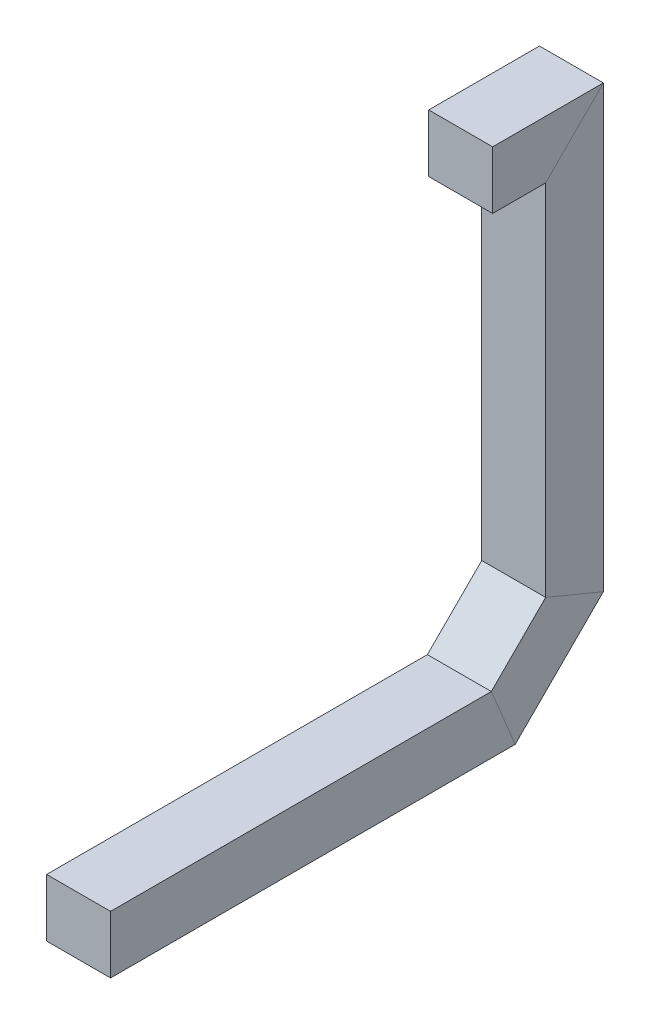
ISO-10303-21;
HEADER;
FILE_DESCRIPTION(('STEP AP214'),'2;1');
FILE_NAME('part.step','',(''),(''),'','','');
FILE_SCHEMA(('AUTOMOTIVE_DESIGN { 1 0 10303 214 1 1 1 1 }'));
ENDSEC;
DATA;
#1=APPLICATION_CONTEXT('core data for automotive mechanical design processes');
#2=APPLICATION_PROTOCOL_DEFINITION('international standard','automotive_design',2000,#1);
#3=PRODUCT_CONTEXT('',#1,'mechanical');
#4=PRODUCT('Part','Part','',(#3));
#5=PRODUCT_RELATED_PRODUCT_CATEGORY('part','',(#4));
#6=PRODUCT_DEFINITION_FORMATION('','',#4);
#7=PRODUCT_DEFINITION_CONTEXT('part definition',#1,'design');
#8=PRODUCT_DEFINITION('design','',#6,#7);
#9=PRODUCT_DEFINITION_SHAPE('','',#8);
#10=(LENGTH_UNIT() NAMED_UNIT(*) SI_UNIT(.MILLI.,.METRE.));
#11=(NAMED_UNIT(*) PLANE_ANGLE_UNIT() SI_UNIT($,.RADIAN.));
#12=(NAMED_UNIT(*) SI_UNIT($,.STERADIAN.) SOLID_ANGLE_UNIT());
#13=UNCERTAINTY_MEASURE_WITH_UNIT(LENGTH_MEASURE(1.E-05),#10,'distance_accuracy_value','');
#14=(GEOMETRIC_REPRESENTATION_CONTEXT(3) GLOBAL_UNCERTAINTY_ASSIGNED_CONTEXT((#13)) GLOBAL_UNIT_ASSIGNED_CONTEXT((#10,
#11,#12)) REPRESENTATION_CONTEXT('',''));
#15=CARTESIAN_POINT('',(0.,0.,0.));
#16=DIRECTION('',(0.,0.,1.));
#17=DIRECTION('',(1.,0.,0.));
#18=AXIS2_PLACEMENT_3D('',#15,#16,#17);
#19=CARTESIAN_POINT('',(0.,2860.04,2387.6));
#20=DIRECTION('',(0.,0.,-1.));
#21=DIRECTION('',(1.,0.,0.));
#22=AXIS2_PLACEMENT_3D('',#19,#20,#21);
#23=PLANE('',#22);
#24=DIRECTION('',(0.,-1.,0.));
#25=VECTOR('',#24,1.);
#26=CARTESIAN_POINT('',(194.406682087314,-178.080899930985,2387.6));
#27=LINE('',#26,#25);
#28=CARTESIAN_POINT('',(194.406682087314,173.000899930981,2387.6));
#29=VERTEX_POINT('',#28);
#30=CARTESIAN_POINT('',(194.406682087314,-178.080899930985,2387.6));
#31=VERTEX_POINT('',#30);
#32=EDGE_CURVE('E107',#29,#31,#27,.T.);
#33=ORIENTED_EDGE('',*,*,#32,.F.);
#34=DIRECTION('',(1.,0.,0.));
#35=VECTOR('',#34,1.);
#36=CARTESIAN_POINT('',(-194.406682087314,173.000899930981,2387.6));
#37=LINE('',#36,#35);
#38=CARTESIAN_POINT('',(-194.406682087314,173.000899930981,2387.6));
#39=VERTEX_POINT('',#38);
#40=EDGE_CURVE('E109',#39,#29,#37,.T.);
#41=ORIENTED_EDGE('',*,*,#40,.F.);
#42=DIRECTION('',(0.,1.,0.));
#43=VECTOR('',#42,1.);
#44=CARTESIAN_POINT('',(-194.406682087314,-178.080899930985,2387.6));
#45=LINE('',#44,#43);
#46=CARTESIAN_POINT('',(-194.406682087314,-178.080899930985,2387.6));
#47=VERTEX_POINT('',#46);
#48=EDGE_CURVE('E92',#47,#39,#45,.T.);
#49=ORIENTED_EDGE('',*,*,#48,.F.);
#50=DIRECTION('',(-1.,0.,0.));
#51=VECTOR('',#50,1.);
#52=CARTESIAN_POINT('',(-194.406682087314,-178.080899930985,2387.6));
#53=LINE('',#52,#51);
#54=EDGE_CURVE('E99',#31,#47,#53,.T.);
#55=ORIENTED_EDGE('',*,*,#54,.F.);
#56=EDGE_LOOP('',(#33,#41,#49,#55));
#57=FACE_BOUND('',#56,.T.);
#58=ADVANCED_FACE('F33',(#57),#23,.F.);
#59=CARTESIAN_POINT('',(0.,0.,63.5));
#60=DIRECTION('',(0.,0.,1.));
#61=DIRECTION('',(1.,0.,0.));
#62=AXIS2_PLACEMENT_3D('',#59,#60,#61);
#63=PLANE('',#62);
#64=DIRECTION('',(0.,1.,0.));
#65=VECTOR('',#64,1.);
#66=CARTESIAN_POINT('',(194.406682087314,3038.12089993098,63.5));
#67=LINE('',#66,#65);
#68=CARTESIAN_POINT('',(194.406682087314,2687.03910006902,63.5));
#69=VERTEX_POINT('',#68);
#70=CARTESIAN_POINT('',(194.406682087314,3038.12089993098,63.5));
#71=VERTEX_POINT('',#70);
#72=EDGE_CURVE('E178',#69,#71,#67,.T.);
#73=ORIENTED_EDGE('',*,*,#72,.T.);
#74=DIRECTION('',(-1.,0.,0.));
#75=VECTOR('',#74,1.);
#76=CARTESIAN_POINT('',(-194.406682087314,3038.12089993098,63.5));
#77=LINE('',#76,#75);
#78=CARTESIAN_POINT('',(-194.406682087314,3038.12089993098,63.5));
#79=VERTEX_POINT('',#78);
#80=EDGE_CURVE('E174',#71,#79,#77,.T.);
#81=ORIENTED_EDGE('',*,*,#80,.T.);
#82=DIRECTION('',(0.,-1.,0.));
#83=VECTOR('',#82,1.);
#84=CARTESIAN_POINT('',(-194.406682087314,3038.12089993098,63.5));
#85=LINE('',#84,#83);
#86=CARTESIAN_POINT('',(-194.406682087314,2687.03910006902,63.5));
#87=VERTEX_POINT('',#86);
#88=EDGE_CURVE('E168',#79,#87,#85,.T.);
#89=ORIENTED_EDGE('',*,*,#88,.T.);
#90=DIRECTION('',(1.,0.,0.));
#91=VECTOR('',#90,1.);
#92=CARTESIAN_POINT('',(-194.406682087314,2687.03910006902,63.5));
#93=LINE('',#92,#91);
#94=EDGE_CURVE('E184',#87,#69,#93,.T.);
#95=ORIENTED_EDGE('',*,*,#94,.T.);
#96=EDGE_LOOP('',(#73,#81,#89,#95));
#97=FACE_BOUND('',#96,.T.);
#98=ADVANCED_FACE('F234',(#97),#63,.T.);
#99=CARTESIAN_POINT('',(-194.406682087314,-178.080899930985,-81.2398763461221));
#100=DIRECTION('',(1.,0.,0.));
#101=DIRECTION('',(0.,0.,-1.));
#102=AXIS2_PLACEMENT_3D('',#99,#100,#101);
#103=PLANE('',#102);
#104=DIRECTION('',(0.,-0.923879532511287,-0.38268343236509));
#105=VECTOR('',#104,1.);
#106=CARTESIAN_POINT('',(-194.406682087314,92.6210777975562,38.3649065853613));
#107=LINE('',#106,#105);
#108=CARTESIAN_POINT('',(-194.406682087314,173.000899930981,71.659319054163));
#109=VERTEX_POINT('',#108);
#110=CARTESIAN_POINT('',(-194.406682087314,-178.080899930985,-73.7635239510199));
#111=VERTEX_POINT('',#110);
#112=EDGE_CURVE('E113',#109,#111,#107,.T.);
#113=ORIENTED_EDGE('',*,*,#112,.T.);
#114=DIRECTION('',(0.,0.,1.));
#115=VECTOR('',#114,1.);
#116=CARTESIAN_POINT('',(-194.406682087314,-178.080899930985,-81.2398763461221));
#117=LINE('',#116,#115);
#118=EDGE_CURVE('E36',#111,#47,#117,.T.);
#119=ORIENTED_EDGE('',*,*,#118,.T.);
#120=ORIENTED_EDGE('',*,*,#48,.T.);
#121=DIRECTION('',(0.,0.,1.));
#122=VECTOR('',#121,1.);
#123=CARTESIAN_POINT('',(-194.406682087314,173.000899930981,-81.2398763461221));
#124=LINE('',#123,#122);
#125=EDGE_CURVE('E116',#109,#39,#124,.T.);
#126=ORIENTED_EDGE('',*,*,#125,.F.);
#127=EDGE_LOOP('',(#113,#119,#120,#126));
#128=FACE_BOUND('',#127,.T.);
#129=ADVANCED_FACE('F112',(#128),#103,.F.);
#130=CARTESIAN_POINT('',(-194.406682087314,173.000899930981,-81.2398763461221));
#131=DIRECTION('',(0.,-1.,0.));
#132=DIRECTION('',(0.,0.,-1.));
#133=AXIS2_PLACEMENT_3D('',#130,#131,#132);
#134=PLANE('',#133);
#135=DIRECTION('',(-1.,0.,0.));
#136=VECTOR('',#135,1.);
#137=CARTESIAN_POINT('',(-194.406682087314,173.000899930981,71.6593190541631));
#138=LINE('',#137,#136);
#139=CARTESIAN_POINT('',(194.406682087314,173.000899930981,71.6593190541629));
#140=VERTEX_POINT('',#139);
#141=EDGE_CURVE('E142',#140,#109,#138,.T.);
#142=ORIENTED_EDGE('',*,*,#141,.T.);
#143=ORIENTED_EDGE('',*,*,#125,.T.);
#144=ORIENTED_EDGE('',*,*,#40,.T.);
#145=DIRECTION('',(0.,0.,1.));
#146=VECTOR('',#145,1.);
#147=CARTESIAN_POINT('',(194.406682087314,173.000899930981,-81.2398763461221));
#148=LINE('',#147,#146);
#149=EDGE_CURVE('E120',#140,#29,#148,.T.);
#150=ORIENTED_EDGE('',*,*,#149,.F.);
#151=EDGE_LOOP('',(#142,#143,#144,#150));
#152=FACE_BOUND('',#151,.T.);
#153=ADVANCED_FACE('F240',(#152),#134,.F.);
#154=CARTESIAN_POINT('',(194.406682087314,-178.080899930985,-81.2398763461221));
#155=DIRECTION('',(-1.,0.,0.));
#156=DIRECTION('',(0.,0.,1.));
#157=AXIS2_PLACEMENT_3D('',#154,#155,#156);
#158=PLANE('',#157);
#159=DIRECTION('',(0.,0.923879532511287,0.38268343236509));
#160=VECTOR('',#159,1.);
#161=CARTESIAN_POINT('',(194.406682087314,92.6210777975562,38.3649065853613));
#162=LINE('',#161,#160);
#163=CARTESIAN_POINT('',(194.406682087314,-178.080899930985,-73.7635239510199));
#164=VERTEX_POINT('',#163);
#165=EDGE_CURVE('E139',#164,#140,#162,.T.);
#166=ORIENTED_EDGE('',*,*,#165,.T.);
#167=ORIENTED_EDGE('',*,*,#149,.T.);
#168=ORIENTED_EDGE('',*,*,#32,.T.);
#169=DIRECTION('',(0.,0.,1.));
#170=VECTOR('',#169,1.);
#171=CARTESIAN_POINT('',(194.406682087314,-178.080899930985,-81.2398763461221));
#172=LINE('',#171,#170);
#173=EDGE_CURVE('E104',#164,#31,#172,.T.);
#174=ORIENTED_EDGE('',*,*,#173,.F.);
#175=EDGE_LOOP('',(#166,#167,#168,#174));
#176=FACE_BOUND('',#175,.T.);
#177=ADVANCED_FACE('F282',(#176),#158,.F.);
#178=CARTESIAN_POINT('',(-194.406682087314,-178.080899930985,-81.2398763461221));
#179=DIRECTION('',(0.,1.,0.));
#180=DIRECTION('',(0.,0.,1.));
#181=AXIS2_PLACEMENT_3D('',#178,#179,#180);
#182=PLANE('',#181);
#183=DIRECTION('',(1.,0.,0.));
#184=VECTOR('',#183,1.);
#185=CARTESIAN_POINT('',(-194.406682087314,-178.080899930985,-73.7635239510197));
#186=LINE('',#185,#184);
#187=EDGE_CURVE('E130',#111,#164,#186,.T.);
#188=ORIENTED_EDGE('',*,*,#187,.T.);
#189=ORIENTED_EDGE('',*,*,#173,.T.);
#190=ORIENTED_EDGE('',*,*,#54,.T.);
#191=ORIENTED_EDGE('',*,*,#118,.F.);
#192=EDGE_LOOP('',(#188,#189,#190,#191));
#193=FACE_BOUND('',#192,.T.);
#194=ADVANCED_FACE('F101',(#193),#182,.F.);
#195=CARTESIAN_POINT('',(-194.406682087314,363.323055526097,-615.167479408101));
#196=DIRECTION('',(0.,0.707106781186547,0.707106781186547));
#197=DIRECTION('',(0.,-0.707106781186548,0.707106781186548));
#198=AXIS2_PLACEMENT_3D('',#195,#196,#197);
#199=PLANE('',#198);
#200=DIRECTION('',(0.,-0.707106781186547,0.707106781186547));
#201=VECTOR('',#200,1.);
#202=CARTESIAN_POINT('',(-194.406682087314,363.323055526097,-615.167479408101));
#203=LINE('',#202,#201);
#204=CARTESIAN_POINT('',(-194.406682087314,358.03647604898,-609.880899930984));
#205=VERTEX_POINT('',#204);
#206=EDGE_CURVE('E131',#205,#111,#203,.T.);
#207=ORIENTED_EDGE('',*,*,#206,.F.);
#208=DIRECTION('',(1.,0.,0.));
#209=VECTOR('',#208,1.);
#210=CARTESIAN_POINT('',(-194.406682087314,358.03647604898,-609.880899930984));
#211=LINE('',#210,#209);
#212=CARTESIAN_POINT('',(194.406682087314,358.03647604898,-609.880899930984));
#213=VERTEX_POINT('',#212);
#214=EDGE_CURVE('E148',#205,#213,#211,.T.);
#215=ORIENTED_EDGE('',*,*,#214,.T.);
#216=DIRECTION('',(0.,-0.707106781186547,0.707106781186547));
#217=VECTOR('',#216,1.);
#218=CARTESIAN_POINT('',(194.406682087314,363.323055526097,-615.167479408101));
#219=LINE('',#218,#217);
#220=EDGE_CURVE('E115',#213,#164,#219,.T.);
#221=ORIENTED_EDGE('',*,*,#220,.T.);
#222=ORIENTED_EDGE('',*,*,#187,.F.);
#223=EDGE_LOOP('',(#207,#215,#221,#222));
#224=FACE_BOUND('',#223,.T.);
#225=ADVANCED_FACE('F275',(#224),#199,.F.);
#226=CARTESIAN_POINT('',(194.406682087314,363.323055526097,-615.167479408101));
#227=DIRECTION('',(-1.,0.,0.));
#228=DIRECTION('',(0.,0.,1.));
#229=AXIS2_PLACEMENT_3D('',#226,#227,#228);
#230=PLANE('',#229);
#231=ORIENTED_EDGE('',*,*,#220,.F.);
#232=DIRECTION('',(0.,0.38268343236509,0.923879532511287));
#233=VECTOR('',#232,1.);
#234=CARTESIAN_POINT('',(194.406682087314,753.148331910719,344.003501144828));
#235=LINE('',#234,#233);
#236=CARTESIAN_POINT('',(194.406682087314,503.459319054163,-258.799100069018));
#237=VERTEX_POINT('',#236);
#238=EDGE_CURVE('E162',#213,#237,#235,.T.);
#239=ORIENTED_EDGE('',*,*,#238,.T.);
#240=DIRECTION('',(0.,-0.707106781186547,0.707106781186547));
#241=VECTOR('',#240,1.);
#242=CARTESIAN_POINT('',(194.406682087314,611.575376959671,-366.915157974527));
#243=LINE('',#242,#241);
#244=EDGE_CURVE('E118',#237,#140,#243,.T.);
#245=ORIENTED_EDGE('',*,*,#244,.T.);
#246=ORIENTED_EDGE('',*,*,#165,.F.);
#247=EDGE_LOOP('',(#231,#239,#245,#246));
#248=FACE_BOUND('',#247,.T.);
#249=ADVANCED_FACE('F271',(#248),#230,.F.);
#250=CARTESIAN_POINT('',(-194.406682087314,611.575376959671,-366.915157974527));
#251=DIRECTION('',(0.,-0.707106781186547,-0.707106781186547));
#252=DIRECTION('',(0.,0.707106781186548,-0.707106781186548));
#253=AXIS2_PLACEMENT_3D('',#250,#251,#252);
#254=PLANE('',#253);
#255=ORIENTED_EDGE('',*,*,#244,.F.);
#256=DIRECTION('',(-1.,0.,0.));
#257=VECTOR('',#256,1.);
#258=CARTESIAN_POINT('',(-194.406682087314,503.459319054163,-258.799100069018));
#259=LINE('',#258,#257);
#260=CARTESIAN_POINT('',(-194.406682087314,503.459319054163,-258.799100069018));
#261=VERTEX_POINT('',#260);
#262=EDGE_CURVE('E165',#237,#261,#259,.T.);
#263=ORIENTED_EDGE('',*,*,#262,.T.);
#264=DIRECTION('',(0.,-0.707106781186547,0.707106781186547));
#265=VECTOR('',#264,1.);
#266=CARTESIAN_POINT('',(-194.406682087314,611.575376959671,-366.915157974527));
#267=LINE('',#266,#265);
#268=EDGE_CURVE('E133',#261,#109,#267,.T.);
#269=ORIENTED_EDGE('',*,*,#268,.T.);
#270=ORIENTED_EDGE('',*,*,#141,.F.);
#271=EDGE_LOOP('',(#255,#263,#269,#270));
#272=FACE_BOUND('',#271,.T.);
#273=ADVANCED_FACE('F267',(#272),#254,.F.);
#274=CARTESIAN_POINT('',(-194.406682087314,363.323055526097,-615.167479408101));
#275=DIRECTION('',(1.,0.,0.));
#276=DIRECTION('',(0.,0.,-1.));
#277=AXIS2_PLACEMENT_3D('',#274,#275,#276);
#278=PLANE('',#277);
#279=ORIENTED_EDGE('',*,*,#268,.F.);
#280=DIRECTION('',(0.,-0.38268343236509,-0.923879532511287));
#281=VECTOR('',#280,1.);
#282=CARTESIAN_POINT('',(-194.406682087314,753.148331910719,344.003501144828));
#283=LINE('',#282,#281);
#284=EDGE_CURVE('E145',#261,#205,#283,.T.);
#285=ORIENTED_EDGE('',*,*,#284,.T.);
#286=ORIENTED_EDGE('',*,*,#206,.T.);
#287=ORIENTED_EDGE('',*,*,#112,.F.);
#288=EDGE_LOOP('',(#279,#285,#286,#287));
#289=FACE_BOUND('',#288,.T.);
#290=ADVANCED_FACE('F264',(#289),#278,.F.);
#291=CARTESIAN_POINT('',(-194.406682087314,3056.02898992408,-609.880899930984));
#292=DIRECTION('',(0.,0.,1.));
#293=DIRECTION('',(1.,0.,0.));
#294=AXIS2_PLACEMENT_3D('',#291,#292,#293);
#295=PLANE('',#294);
#296=DIRECTION('',(0.,-1.,0.));
#297=VECTOR('',#296,1.);
#298=CARTESIAN_POINT('',(-194.406682087314,3056.02898992408,-609.880899930984));
#299=LINE('',#298,#297);
#300=CARTESIAN_POINT('',(-194.406682087314,3038.12089993098,-609.880899930983));
#301=VERTEX_POINT('',#300);
#302=EDGE_CURVE('E149',#301,#205,#299,.T.);
#303=ORIENTED_EDGE('',*,*,#302,.F.);
#304=DIRECTION('',(1.,0.,0.));
#305=VECTOR('',#304,1.);
#306=CARTESIAN_POINT('',(-194.406682087314,3038.12089993098,-609.880899930983));
#307=LINE('',#306,#305);
#308=CARTESIAN_POINT('',(194.406682087314,3038.12089993098,-609.880899930983));
#309=VERTEX_POINT('',#308);
#310=EDGE_CURVE('E172',#301,#309,#307,.T.);
#311=ORIENTED_EDGE('',*,*,#310,.T.);
#312=DIRECTION('',(0.,-1.,0.));
#313=VECTOR('',#312,1.);
#314=CARTESIAN_POINT('',(194.406682087314,3056.02898992408,-609.880899930984));
#315=LINE('',#314,#313);
#316=EDGE_CURVE('E144',#309,#213,#315,.T.);
#317=ORIENTED_EDGE('',*,*,#316,.T.);
#318=ORIENTED_EDGE('',*,*,#214,.F.);
#319=EDGE_LOOP('',(#303,#311,#317,#318));
#320=FACE_BOUND('',#319,.T.);
#321=ADVANCED_FACE('F224',(#320),#295,.F.);
#322=CARTESIAN_POINT('',(194.406682087314,3056.02898992408,-609.880899930984));
#323=DIRECTION('',(-1.,0.,0.));
#324=DIRECTION('',(0.,0.,1.));
#325=AXIS2_PLACEMENT_3D('',#322,#323,#324);
#326=PLANE('',#325);
#327=ORIENTED_EDGE('',*,*,#316,.F.);
#328=DIRECTION('',(0.,-0.707106781186548,0.707106781186548));
#329=VECTOR('',#328,1.);
#330=CARTESIAN_POINT('',(194.406682087314,2701.43044996549,-273.190449965491));
#331=LINE('',#330,#329);
#332=CARTESIAN_POINT('',(194.406682087314,2687.03910006902,-258.799100069018));
#333=VERTEX_POINT('',#332);
#334=EDGE_CURVE('E42',#309,#333,#331,.T.);
#335=ORIENTED_EDGE('',*,*,#334,.T.);
#336=DIRECTION('',(0.,-1.,0.));
#337=VECTOR('',#336,1.);
#338=CARTESIAN_POINT('',(194.406682087314,3056.02898992408,-258.799100069018));
#339=LINE('',#338,#337);
#340=EDGE_CURVE('E155',#333,#237,#339,.T.);
#341=ORIENTED_EDGE('',*,*,#340,.T.);
#342=ORIENTED_EDGE('',*,*,#238,.F.);
#343=EDGE_LOOP('',(#327,#335,#341,#342));
#344=FACE_BOUND('',#343,.T.);
#345=ADVANCED_FACE('F200',(#344),#326,.F.);
#346=CARTESIAN_POINT('',(-194.406682087314,3056.02898992408,-258.799100069018));
#347=DIRECTION('',(0.,0.,-1.));
#348=DIRECTION('',(-1.,0.,0.));
#349=AXIS2_PLACEMENT_3D('',#346,#347,#348);
#350=PLANE('',#349);
#351=ORIENTED_EDGE('',*,*,#340,.F.);
#352=DIRECTION('',(-1.,0.,0.));
#353=VECTOR('',#352,1.);
#354=CARTESIAN_POINT('',(-194.406682087314,2687.03910006902,-258.799100069017));
#355=LINE('',#354,#353);
#356=CARTESIAN_POINT('',(-194.406682087314,2687.03910006902,-258.799100069018));
#357=VERTEX_POINT('',#356);
#358=EDGE_CURVE('E11',#333,#357,#355,.T.);
#359=ORIENTED_EDGE('',*,*,#358,.T.);
#360=DIRECTION('',(0.,-1.,0.));
#361=VECTOR('',#360,1.);
#362=CARTESIAN_POINT('',(-194.406682087314,3056.02898992408,-258.799100069018));
#363=LINE('',#362,#361);
#364=EDGE_CURVE('E152',#357,#261,#363,.T.);
#365=ORIENTED_EDGE('',*,*,#364,.T.);
#366=ORIENTED_EDGE('',*,*,#262,.F.);
#367=EDGE_LOOP('',(#351,#359,#365,#366));
#368=FACE_BOUND('',#367,.T.);
#369=ADVANCED_FACE('F256',(#368),#350,.F.);
#370=CARTESIAN_POINT('',(-194.406682087314,3056.02898992408,-609.880899930984));
#371=DIRECTION('',(1.,0.,0.));
#372=DIRECTION('',(0.,0.,-1.));
#373=AXIS2_PLACEMENT_3D('',#370,#371,#372);
#374=PLANE('',#373);
#375=ORIENTED_EDGE('',*,*,#364,.F.);
#376=DIRECTION('',(0.,0.707106781186548,-0.707106781186548));
#377=VECTOR('',#376,1.);
#378=CARTESIAN_POINT('',(-194.406682087314,2701.43044996549,-273.190449965491));
#379=LINE('',#378,#377);
#380=EDGE_CURVE('E169',#357,#301,#379,.T.);
#381=ORIENTED_EDGE('',*,*,#380,.T.);
#382=ORIENTED_EDGE('',*,*,#302,.T.);
#383=ORIENTED_EDGE('',*,*,#284,.F.);
#384=EDGE_LOOP('',(#375,#381,#382,#383));
#385=FACE_BOUND('',#384,.T.);
#386=ADVANCED_FACE('F228',(#385),#374,.F.);
#387=CARTESIAN_POINT('',(-194.406682087314,3038.12089993098,63.5));
#388=DIRECTION('',(0.,-1.,0.));
#389=DIRECTION('',(0.,0.,-1.));
#390=AXIS2_PLACEMENT_3D('',#387,#388,#389);
#391=PLANE('',#390);
#392=DIRECTION('',(0.,0.,-1.));
#393=VECTOR('',#392,1.);
#394=CARTESIAN_POINT('',(-194.406682087314,3038.12089993098,63.5));
#395=LINE('',#394,#393);
#396=EDGE_CURVE('E177',#79,#301,#395,.T.);
#397=ORIENTED_EDGE('',*,*,#396,.F.);
#398=ORIENTED_EDGE('',*,*,#80,.F.);
#399=DIRECTION('',(0.,0.,-1.));
#400=VECTOR('',#399,1.);
#401=CARTESIAN_POINT('',(194.406682087314,3038.12089993098,63.5));
#402=LINE('',#401,#400);
#403=EDGE_CURVE('E173',#71,#309,#402,.T.);
#404=ORIENTED_EDGE('',*,*,#403,.T.);
#405=ORIENTED_EDGE('',*,*,#310,.F.);
#406=EDGE_LOOP('',(#397,#398,#404,#405));
#407=FACE_BOUND('',#406,.T.);
#408=ADVANCED_FACE('F222',(#407),#391,.F.);
#409=CARTESIAN_POINT('',(194.406682087314,3038.12089993098,63.5));
#410=DIRECTION('',(-1.,0.,0.));
#411=DIRECTION('',(0.,0.,1.));
#412=AXIS2_PLACEMENT_3D('',#409,#410,#411);
#413=PLANE('',#412);
#414=ORIENTED_EDGE('',*,*,#403,.F.);
#415=ORIENTED_EDGE('',*,*,#72,.F.);
#416=DIRECTION('',(0.,0.,-1.));
#417=VECTOR('',#416,1.);
#418=CARTESIAN_POINT('',(194.406682087314,2687.03910006902,63.5));
#419=LINE('',#418,#417);
#420=EDGE_CURVE('E181',#69,#333,#419,.T.);
#421=ORIENTED_EDGE('',*,*,#420,.T.);
#422=ORIENTED_EDGE('',*,*,#334,.F.);
#423=EDGE_LOOP('',(#414,#415,#421,#422));
#424=FACE_BOUND('',#423,.T.);
#425=ADVANCED_FACE('F204',(#424),#413,.F.);
#426=CARTESIAN_POINT('',(-194.406682087314,2687.03910006902,63.5));
#427=DIRECTION('',(0.,1.,0.));
#428=DIRECTION('',(0.,0.,1.));
#429=AXIS2_PLACEMENT_3D('',#426,#427,#428);
#430=PLANE('',#429);
#431=ORIENTED_EDGE('',*,*,#420,.F.);
#432=ORIENTED_EDGE('',*,*,#94,.F.);
#433=DIRECTION('',(0.,0.,-1.));
#434=VECTOR('',#433,1.);
#435=CARTESIAN_POINT('',(-194.406682087314,2687.03910006902,63.5));
#436=LINE('',#435,#434);
#437=EDGE_CURVE('E187',#87,#357,#436,.T.);
#438=ORIENTED_EDGE('',*,*,#437,.T.);
#439=ORIENTED_EDGE('',*,*,#358,.F.);
#440=EDGE_LOOP('',(#431,#432,#438,#439));
#441=FACE_BOUND('',#440,.T.);
#442=ADVANCED_FACE('F207',(#441),#430,.F.);
#443=CARTESIAN_POINT('',(-194.406682087314,3038.12089993098,63.5));
#444=DIRECTION('',(1.,0.,0.));
#445=DIRECTION('',(0.,0.,-1.));
#446=AXIS2_PLACEMENT_3D('',#443,#444,#445);
#447=PLANE('',#446);
#448=ORIENTED_EDGE('',*,*,#437,.F.);
#449=ORIENTED_EDGE('',*,*,#88,.F.);
#450=ORIENTED_EDGE('',*,*,#396,.T.);
#451=ORIENTED_EDGE('',*,*,#380,.F.);
#452=EDGE_LOOP('',(#448,#449,#450,#451));
#453=FACE_BOUND('',#452,.T.);
#454=ADVANCED_FACE('F232',(#453),#447,.F.);
#455=CLOSED_SHELL('',(#58,#98,#129,#153,#177,#194,#225,#249,#273,#290,#321,#345,#369,#386,#408,
#425,#442,#454));
#456=MANIFOLD_SOLID_BREP('B2',#455);
#457=ADVANCED_BREP_SHAPE_REPRESENTATION('',(#18,#456),#14);
#458=SHAPE_DEFINITION_REPRESENTATION(#9,#457);
ENDSEC;
END-ISO-10303-21;
